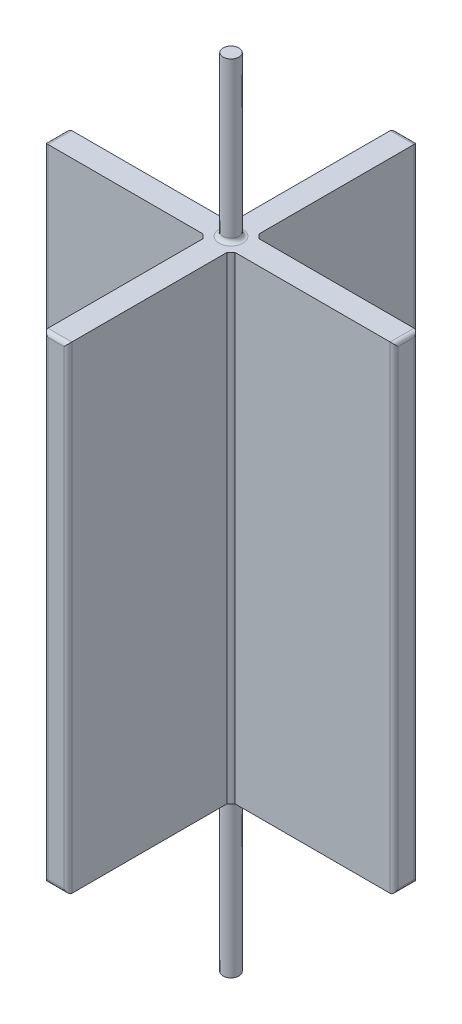
ISO-10303-21;
HEADER;
FILE_DESCRIPTION(('STEP AP214'),'2;1');
FILE_NAME('part.step','',(''),(''),'','','');
FILE_SCHEMA(('AUTOMOTIVE_DESIGN { 1 0 10303 214 1 1 1 1 }'));
ENDSEC;
DATA;
#1=APPLICATION_CONTEXT('core data for automotive mechanical design processes');
#2=APPLICATION_PROTOCOL_DEFINITION('international standard','automotive_design',2000,#1);
#3=PRODUCT_CONTEXT('',#1,'mechanical');
#4=PRODUCT('Part','Part','',(#3));
#5=PRODUCT_RELATED_PRODUCT_CATEGORY('part','',(#4));
#6=PRODUCT_DEFINITION_FORMATION('','',#4);
#7=PRODUCT_DEFINITION_CONTEXT('part definition',#1,'design');
#8=PRODUCT_DEFINITION('design','',#6,#7);
#9=PRODUCT_DEFINITION_SHAPE('','',#8);
#10=(LENGTH_UNIT() NAMED_UNIT(*) SI_UNIT(.MILLI.,.METRE.));
#11=(NAMED_UNIT(*) PLANE_ANGLE_UNIT() SI_UNIT($,.RADIAN.));
#12=(NAMED_UNIT(*) SI_UNIT($,.STERADIAN.) SOLID_ANGLE_UNIT());
#13=UNCERTAINTY_MEASURE_WITH_UNIT(LENGTH_MEASURE(1.E-05),#10,'distance_accuracy_value','');
#14=(GEOMETRIC_REPRESENTATION_CONTEXT(3) GLOBAL_UNCERTAINTY_ASSIGNED_CONTEXT((#13)) GLOBAL_UNIT_ASSIGNED_CONTEXT((#10,
#11,#12)) REPRESENTATION_CONTEXT('',''));
#15=CARTESIAN_POINT('',(0.,0.,0.));
#16=DIRECTION('',(0.,0.,1.));
#17=DIRECTION('',(1.,0.,0.));
#18=AXIS2_PLACEMENT_3D('',#15,#16,#17);
#19=CARTESIAN_POINT('',(0.,60.,-1.50000000000001));
#20=DIRECTION('',(0.,0.,1.));
#21=DIRECTION('',(1.,0.,0.));
#22=AXIS2_PLACEMENT_3D('',#19,#20,#21);
#23=PLANE('',#22);
#24=DIRECTION('',(-1.,0.,0.));
#25=VECTOR('',#24,1.);
#26=CARTESIAN_POINT('',(0.,60.,-1.50000000000001));
#27=LINE('',#26,#25);
#28=CARTESIAN_POINT('',(21.5,60.,-1.49999999999993));
#29=VERTEX_POINT('',#28);
#30=CARTESIAN_POINT('',(2.,60.,-1.5));
#31=VERTEX_POINT('',#30);
#32=EDGE_CURVE('E333',#29,#31,#27,.T.);
#33=ORIENTED_EDGE('',*,*,#32,.F.);
#34=DIRECTION('',(0.,-1.,0.));
#35=VECTOR('',#34,1.);
#36=CARTESIAN_POINT('',(21.5,0.,-1.49999999999993));
#37=LINE('',#36,#35);
#38=CARTESIAN_POINT('',(21.5,0.,-1.49999999999993));
#39=VERTEX_POINT('',#38);
#40=EDGE_CURVE('E385',#29,#39,#37,.T.);
#41=ORIENTED_EDGE('',*,*,#40,.T.);
#42=DIRECTION('',(-1.,0.,0.));
#43=VECTOR('',#42,1.);
#44=CARTESIAN_POINT('',(0.,0.,-1.50000000000001));
#45=LINE('',#44,#43);
#46=CARTESIAN_POINT('',(2.,0.,-1.5));
#47=VERTEX_POINT('',#46);
#48=EDGE_CURVE('E359',#39,#47,#45,.T.);
#49=ORIENTED_EDGE('',*,*,#48,.T.);
#50=DIRECTION('',(0.,-1.,0.));
#51=VECTOR('',#50,1.);
#52=CARTESIAN_POINT('',(2.,60.,-1.5));
#53=LINE('',#52,#51);
#54=EDGE_CURVE('E351',#31,#47,#53,.T.);
#55=ORIENTED_EDGE('',*,*,#54,.F.);
#56=EDGE_LOOP('',(#33,#41,#49,#55));
#57=FACE_BOUND('',#56,.T.);
#58=ADVANCED_FACE('F172',(#57),#23,.F.);
#59=CARTESIAN_POINT('',(0.,60.,0.));
#60=DIRECTION('',(0.,-1.,0.));
#61=DIRECTION('',(0.,0.,-1.));
#62=AXIS2_PLACEMENT_3D('',#59,#60,#61);
#63=CYLINDRICAL_SURFACE('',#62,2.5);
#64=CARTESIAN_POINT('',(0.,0.,0.));
#65=DIRECTION('',(0.,1.,0.));
#66=DIRECTION('',(0.,0.,1.));
#67=AXIS2_PLACEMENT_3D('',#64,#65,#66);
#68=CIRCLE('',#67,2.5);
#69=CARTESIAN_POINT('',(1.50000000000001,0.,-2.));
#70=VERTEX_POINT('',#69);
#71=EDGE_CURVE('E587',#47,#70,#68,.T.);
#72=ORIENTED_EDGE('',*,*,#71,.T.);
#73=DIRECTION('',(0.,-1.,0.));
#74=VECTOR('',#73,1.);
#75=CARTESIAN_POINT('',(1.50000000000001,60.,-2.));
#76=LINE('',#75,#74);
#77=CARTESIAN_POINT('',(1.50000000000001,60.,-2.));
#78=VERTEX_POINT('',#77);
#79=EDGE_CURVE('E353',#78,#70,#76,.T.);
#80=ORIENTED_EDGE('',*,*,#79,.F.);
#81=CARTESIAN_POINT('',(0.,60.,0.));
#82=DIRECTION('',(0.,1.,0.));
#83=DIRECTION('',(0.,0.,1.));
#84=AXIS2_PLACEMENT_3D('',#81,#82,#83);
#85=CIRCLE('',#84,2.5);
#86=EDGE_CURVE('E338',#31,#78,#85,.T.);
#87=ORIENTED_EDGE('',*,*,#86,.F.);
#88=ORIENTED_EDGE('',*,*,#54,.T.);
#89=EDGE_LOOP('',(#72,#80,#87,#88));
#90=FACE_BOUND('',#89,.T.);
#91=ADVANCED_FACE('F350',(#90),#63,.T.);
#92=CARTESIAN_POINT('',(1.50000000000001,60.,0.));
#93=DIRECTION('',(1.,0.,0.));
#94=DIRECTION('',(0.,0.,-1.));
#95=AXIS2_PLACEMENT_3D('',#92,#93,#94);
#96=PLANE('',#95);
#97=DIRECTION('',(0.,0.,1.));
#98=VECTOR('',#97,1.);
#99=CARTESIAN_POINT('',(1.50000000000001,0.,0.));
#100=LINE('',#99,#98);
#101=CARTESIAN_POINT('',(1.5,0.,-21.5));
#102=VERTEX_POINT('',#101);
#103=EDGE_CURVE('E582',#102,#70,#100,.T.);
#104=ORIENTED_EDGE('',*,*,#103,.F.);
#105=DIRECTION('',(0.,-1.,0.));
#106=VECTOR('',#105,1.);
#107=CARTESIAN_POINT('',(1.5,60.,-21.5));
#108=LINE('',#107,#106);
#109=CARTESIAN_POINT('',(1.5,60.,-21.5));
#110=VERTEX_POINT('',#109);
#111=EDGE_CURVE('E429',#102,#110,#108,.F.);
#112=ORIENTED_EDGE('',*,*,#111,.T.);
#113=DIRECTION('',(0.,0.,1.));
#114=VECTOR('',#113,1.);
#115=CARTESIAN_POINT('',(1.50000000000001,60.,0.));
#116=LINE('',#115,#114);
#117=EDGE_CURVE('E354',#110,#78,#116,.T.);
#118=ORIENTED_EDGE('',*,*,#117,.T.);
#119=ORIENTED_EDGE('',*,*,#79,.T.);
#120=EDGE_LOOP('',(#104,#112,#118,#119));
#121=FACE_BOUND('',#120,.T.);
#122=ADVANCED_FACE('F500',(#121),#96,.T.);
#123=CARTESIAN_POINT('',(0.,60.,-22.));
#124=DIRECTION('',(0.,0.,-1.));
#125=DIRECTION('',(-1.,0.,0.));
#126=AXIS2_PLACEMENT_3D('',#123,#124,#125);
#127=PLANE('',#126);
#128=DIRECTION('',(1.,0.,0.));
#129=VECTOR('',#128,1.);
#130=CARTESIAN_POINT('',(0.,59.5,-22.));
#131=LINE('',#130,#129);
#132=CARTESIAN_POINT('',(-1.,59.5,-22.));
#133=VERTEX_POINT('',#132);
#134=CARTESIAN_POINT('',(0.999999999999997,59.5,-22.));
#135=VERTEX_POINT('',#134);
#136=EDGE_CURVE('E187',#133,#135,#131,.T.);
#137=ORIENTED_EDGE('',*,*,#136,.T.);
#138=DIRECTION('',(0.,-1.,0.));
#139=VECTOR('',#138,1.);
#140=CARTESIAN_POINT('',(0.999999999999997,60.,-22.));
#141=LINE('',#140,#139);
#142=CARTESIAN_POINT('',(0.999999999999997,0.5,-22.));
#143=VERTEX_POINT('',#142);
#144=EDGE_CURVE('E427',#135,#143,#141,.T.);
#145=ORIENTED_EDGE('',*,*,#144,.T.);
#146=DIRECTION('',(1.,0.,0.));
#147=VECTOR('',#146,1.);
#148=CARTESIAN_POINT('',(-1.5,0.5,-22.));
#149=LINE('',#148,#147);
#150=CARTESIAN_POINT('',(-1.,0.5,-22.));
#151=VERTEX_POINT('',#150);
#152=EDGE_CURVE('E423',#143,#151,#149,.F.);
#153=ORIENTED_EDGE('',*,*,#152,.T.);
#154=DIRECTION('',(0.,-1.,0.));
#155=VECTOR('',#154,1.);
#156=CARTESIAN_POINT('',(-1.,60.,-22.));
#157=LINE('',#156,#155);
#158=EDGE_CURVE('E192',#151,#133,#157,.F.);
#159=ORIENTED_EDGE('',*,*,#158,.T.);
#160=EDGE_LOOP('',(#137,#145,#153,#159));
#161=FACE_BOUND('',#160,.T.);
#162=ADVANCED_FACE('F713',(#161),#127,.T.);
#163=CARTESIAN_POINT('',(-1.50000000000001,60.,0.));
#164=DIRECTION('',(1.,0.,0.));
#165=DIRECTION('',(0.,0.,-1.));
#166=AXIS2_PLACEMENT_3D('',#163,#164,#165);
#167=PLANE('',#166);
#168=DIRECTION('',(0.,0.,1.));
#169=VECTOR('',#168,1.);
#170=CARTESIAN_POINT('',(-1.50000000000001,60.,0.));
#171=LINE('',#170,#169);
#172=CARTESIAN_POINT('',(-1.5,60.,-21.5));
#173=VERTEX_POINT('',#172);
#174=CARTESIAN_POINT('',(-1.50000000000001,60.,-2.));
#175=VERTEX_POINT('',#174);
#176=EDGE_CURVE('E593',#173,#175,#171,.T.);
#177=ORIENTED_EDGE('',*,*,#176,.F.);
#178=DIRECTION('',(0.,-1.,0.));
#179=VECTOR('',#178,1.);
#180=CARTESIAN_POINT('',(-1.5,0.,-21.5));
#181=LINE('',#180,#179);
#182=CARTESIAN_POINT('',(-1.5,0.,-21.5));
#183=VERTEX_POINT('',#182);
#184=EDGE_CURVE('E432',#173,#183,#181,.T.);
#185=ORIENTED_EDGE('',*,*,#184,.T.);
#186=DIRECTION('',(0.,0.,1.));
#187=VECTOR('',#186,1.);
#188=CARTESIAN_POINT('',(-1.50000000000001,0.,0.));
#189=LINE('',#188,#187);
#190=CARTESIAN_POINT('',(-1.50000000000001,0.,-2.));
#191=VERTEX_POINT('',#190);
#192=EDGE_CURVE('E584',#183,#191,#189,.T.);
#193=ORIENTED_EDGE('',*,*,#192,.T.);
#194=DIRECTION('',(0.,-1.,0.));
#195=VECTOR('',#194,1.);
#196=CARTESIAN_POINT('',(-1.50000000000001,60.,-2.));
#197=LINE('',#196,#195);
#198=EDGE_CURVE('E365',#175,#191,#197,.T.);
#199=ORIENTED_EDGE('',*,*,#198,.F.);
#200=EDGE_LOOP('',(#177,#185,#193,#199));
#201=FACE_BOUND('',#200,.T.);
#202=ADVANCED_FACE('F596',(#201),#167,.F.);
#203=CARTESIAN_POINT('',(-1.99999999999998,0.,-1.50000000000003));
#204=VERTEX_POINT('',#203);
#205=EDGE_CURVE('E616',#191,#204,#68,.T.);
#206=ORIENTED_EDGE('',*,*,#205,.T.);
#207=DIRECTION('',(0.,-1.,0.));
#208=VECTOR('',#207,1.);
#209=CARTESIAN_POINT('',(-1.99999999999998,60.,-1.50000000000003));
#210=LINE('',#209,#208);
#211=CARTESIAN_POINT('',(-1.99999999999998,60.,-1.50000000000003));
#212=VERTEX_POINT('',#211);
#213=EDGE_CURVE('E640',#212,#204,#210,.T.);
#214=ORIENTED_EDGE('',*,*,#213,.F.);
#215=EDGE_CURVE('E357',#175,#212,#85,.T.);
#216=ORIENTED_EDGE('',*,*,#215,.F.);
#217=ORIENTED_EDGE('',*,*,#198,.T.);
#218=EDGE_LOOP('',(#206,#214,#216,#217));
#219=FACE_BOUND('',#218,.T.);
#220=ADVANCED_FACE('F502',(#219),#63,.T.);
#221=CARTESIAN_POINT('',(0.,60.,-1.50000000000001));
#222=DIRECTION('',(0.,0.,-1.));
#223=DIRECTION('',(-1.,0.,0.));
#224=AXIS2_PLACEMENT_3D('',#221,#222,#223);
#225=PLANE('',#224);
#226=DIRECTION('',(1.,0.,0.));
#227=VECTOR('',#226,1.);
#228=CARTESIAN_POINT('',(0.,0.,-1.50000000000001));
#229=LINE('',#228,#227);
#230=CARTESIAN_POINT('',(-21.5,0.,-1.50000000000022));
#231=VERTEX_POINT('',#230);
#232=EDGE_CURVE('E619',#231,#204,#229,.T.);
#233=ORIENTED_EDGE('',*,*,#232,.F.);
#234=DIRECTION('',(0.,-1.,0.));
#235=VECTOR('',#234,1.);
#236=CARTESIAN_POINT('',(-21.5,60.,-1.50000000000022));
#237=LINE('',#236,#235);
#238=CARTESIAN_POINT('',(-21.5,60.,-1.50000000000022));
#239=VERTEX_POINT('',#238);
#240=EDGE_CURVE('E418',#231,#239,#237,.F.);
#241=ORIENTED_EDGE('',*,*,#240,.T.);
#242=DIRECTION('',(1.,0.,0.));
#243=VECTOR('',#242,1.);
#244=CARTESIAN_POINT('',(0.,60.,-1.50000000000001));
#245=LINE('',#244,#243);
#246=EDGE_CURVE('E600',#239,#212,#245,.T.);
#247=ORIENTED_EDGE('',*,*,#246,.T.);
#248=ORIENTED_EDGE('',*,*,#213,.T.);
#249=EDGE_LOOP('',(#233,#241,#247,#248));
#250=FACE_BOUND('',#249,.T.);
#251=ADVANCED_FACE('F707',(#250),#225,.T.);
#252=CARTESIAN_POINT('',(-22.,60.,-2.54426109809932E-13));
#253=DIRECTION('',(-1.,0.,0.));
#254=DIRECTION('',(0.,0.,1.));
#255=AXIS2_PLACEMENT_3D('',#252,#253,#254);
#256=PLANE('',#255);
#257=DIRECTION('',(0.,0.,-1.));
#258=VECTOR('',#257,1.);
#259=CARTESIAN_POINT('',(-22.,59.5,-2.54426109809932E-13));
#260=LINE('',#259,#258);
#261=CARTESIAN_POINT('',(-22.,59.5,0.999999999999771));
#262=VERTEX_POINT('',#261);
#263=CARTESIAN_POINT('',(-22.,59.5,-1.00000000000023));
#264=VERTEX_POINT('',#263);
#265=EDGE_CURVE('E413',#262,#264,#260,.T.);
#266=ORIENTED_EDGE('',*,*,#265,.T.);
#267=DIRECTION('',(0.,-1.,0.));
#268=VECTOR('',#267,1.);
#269=CARTESIAN_POINT('',(-22.,60.,-1.00000000000023));
#270=LINE('',#269,#268);
#271=CARTESIAN_POINT('',(-22.,0.5,-1.00000000000023));
#272=VERTEX_POINT('',#271);
#273=EDGE_CURVE('E415',#264,#272,#270,.T.);
#274=ORIENTED_EDGE('',*,*,#273,.T.);
#275=DIRECTION('',(0.,0.,-1.));
#276=VECTOR('',#275,1.);
#277=CARTESIAN_POINT('',(-22.,0.5,1.49999999999977));
#278=LINE('',#277,#276);
#279=CARTESIAN_POINT('',(-22.,0.5,0.999999999999771));
#280=VERTEX_POINT('',#279);
#281=EDGE_CURVE('E409',#272,#280,#278,.F.);
#282=ORIENTED_EDGE('',*,*,#281,.T.);
#283=DIRECTION('',(0.,-1.,0.));
#284=VECTOR('',#283,1.);
#285=CARTESIAN_POINT('',(-22.,60.,0.999999999999771));
#286=LINE('',#285,#284);
#287=EDGE_CURVE('E411',#280,#262,#286,.F.);
#288=ORIENTED_EDGE('',*,*,#287,.T.);
#289=EDGE_LOOP('',(#266,#274,#282,#288));
#290=FACE_BOUND('',#289,.T.);
#291=ADVANCED_FACE('F703',(#290),#256,.T.);
#292=CARTESIAN_POINT('',(0.,60.,1.50000000000001));
#293=DIRECTION('',(0.,0.,-1.));
#294=DIRECTION('',(-1.,0.,0.));
#295=AXIS2_PLACEMENT_3D('',#292,#293,#294);
#296=PLANE('',#295);
#297=DIRECTION('',(1.,0.,0.));
#298=VECTOR('',#297,1.);
#299=CARTESIAN_POINT('',(0.,60.,1.50000000000001));
#300=LINE('',#299,#298);
#301=CARTESIAN_POINT('',(-21.5,60.,1.49999999999978));
#302=VERTEX_POINT('',#301);
#303=CARTESIAN_POINT('',(-2.00000000000001,60.,1.49999999999998));
#304=VERTEX_POINT('',#303);
#305=EDGE_CURVE('E605',#302,#304,#300,.T.);
#306=ORIENTED_EDGE('',*,*,#305,.F.);
#307=DIRECTION('',(0.,-1.,0.));
#308=VECTOR('',#307,1.);
#309=CARTESIAN_POINT('',(-21.5,0.,1.49999999999978));
#310=LINE('',#309,#308);
#311=CARTESIAN_POINT('',(-21.5,0.,1.49999999999978));
#312=VERTEX_POINT('',#311);
#313=EDGE_CURVE('E421',#302,#312,#310,.T.);
#314=ORIENTED_EDGE('',*,*,#313,.T.);
#315=DIRECTION('',(1.,0.,0.));
#316=VECTOR('',#315,1.);
#317=CARTESIAN_POINT('',(0.,0.,1.50000000000001));
#318=LINE('',#317,#316);
#319=CARTESIAN_POINT('',(-2.00000000000001,0.,1.49999999999998));
#320=VERTEX_POINT('',#319);
#321=EDGE_CURVE('E621',#312,#320,#318,.T.);
#322=ORIENTED_EDGE('',*,*,#321,.T.);
#323=DIRECTION('',(0.,-1.,0.));
#324=VECTOR('',#323,1.);
#325=CARTESIAN_POINT('',(-2.00000000000001,60.,1.49999999999998));
#326=LINE('',#325,#324);
#327=EDGE_CURVE('E637',#304,#320,#326,.T.);
#328=ORIENTED_EDGE('',*,*,#327,.F.);
#329=EDGE_LOOP('',(#306,#314,#322,#328));
#330=FACE_BOUND('',#329,.T.);
#331=ADVANCED_FACE('F700',(#330),#296,.F.);
#332=CARTESIAN_POINT('',(-1.50000000000002,0.,1.99999999999999));
#333=VERTEX_POINT('',#332);
#334=EDGE_CURVE('E623',#320,#333,#68,.T.);
#335=ORIENTED_EDGE('',*,*,#334,.T.);
#336=DIRECTION('',(0.,-1.,0.));
#337=VECTOR('',#336,1.);
#338=CARTESIAN_POINT('',(-1.50000000000002,60.,1.99999999999999));
#339=LINE('',#338,#337);
#340=CARTESIAN_POINT('',(-1.50000000000002,60.,1.99999999999999));
#341=VERTEX_POINT('',#340);
#342=EDGE_CURVE('E634',#341,#333,#339,.T.);
#343=ORIENTED_EDGE('',*,*,#342,.F.);
#344=EDGE_CURVE('E601',#304,#341,#85,.T.);
#345=ORIENTED_EDGE('',*,*,#344,.F.);
#346=ORIENTED_EDGE('',*,*,#327,.T.);
#347=EDGE_LOOP('',(#335,#343,#345,#346));
#348=FACE_BOUND('',#347,.T.);
#349=ADVANCED_FACE('F670',(#348),#63,.T.);
#350=CARTESIAN_POINT('',(-1.50000000000001,60.,0.));
#351=DIRECTION('',(-1.,0.,0.));
#352=DIRECTION('',(0.,0.,1.));
#353=AXIS2_PLACEMENT_3D('',#350,#351,#352);
#354=PLANE('',#353);
#355=DIRECTION('',(0.,0.,-1.));
#356=VECTOR('',#355,1.);
#357=CARTESIAN_POINT('',(-1.50000000000001,0.,0.));
#358=LINE('',#357,#356);
#359=CARTESIAN_POINT('',(-1.50000000000015,0.,21.5));
#360=VERTEX_POINT('',#359);
#361=EDGE_CURVE('E624',#360,#333,#358,.T.);
#362=ORIENTED_EDGE('',*,*,#361,.F.);
#363=DIRECTION('',(0.,-1.,0.));
#364=VECTOR('',#363,1.);
#365=CARTESIAN_POINT('',(-1.50000000000015,60.,21.5));
#366=LINE('',#365,#364);
#367=CARTESIAN_POINT('',(-1.50000000000015,60.,21.5));
#368=VERTEX_POINT('',#367);
#369=EDGE_CURVE('E404',#360,#368,#366,.F.);
#370=ORIENTED_EDGE('',*,*,#369,.T.);
#371=DIRECTION('',(0.,0.,-1.));
#372=VECTOR('',#371,1.);
#373=CARTESIAN_POINT('',(-1.50000000000001,60.,0.));
#374=LINE('',#373,#372);
#375=EDGE_CURVE('E607',#368,#341,#374,.T.);
#376=ORIENTED_EDGE('',*,*,#375,.T.);
#377=ORIENTED_EDGE('',*,*,#342,.T.);
#378=EDGE_LOOP('',(#362,#370,#376,#377));
#379=FACE_BOUND('',#378,.T.);
#380=ADVANCED_FACE('F673',(#379),#354,.T.);
#381=CARTESIAN_POINT('',(-1.52655665885959E-13,60.,22.));
#382=DIRECTION('',(0.,0.,1.));
#383=DIRECTION('',(1.,0.,0.));
#384=AXIS2_PLACEMENT_3D('',#381,#382,#383);
#385=PLANE('',#384);
#386=DIRECTION('',(-1.,0.,0.));
#387=VECTOR('',#386,1.);
#388=CARTESIAN_POINT('',(-1.52655665885959E-13,59.5,22.));
#389=LINE('',#388,#387);
#390=CARTESIAN_POINT('',(0.999999999999849,59.5,22.));
#391=VERTEX_POINT('',#390);
#392=CARTESIAN_POINT('',(-1.00000000000015,59.5,22.));
#393=VERTEX_POINT('',#392);
#394=EDGE_CURVE('E399',#391,#393,#389,.T.);
#395=ORIENTED_EDGE('',*,*,#394,.T.);
#396=DIRECTION('',(0.,-1.,0.));
#397=VECTOR('',#396,1.);
#398=CARTESIAN_POINT('',(-1.00000000000015,60.,22.));
#399=LINE('',#398,#397);
#400=CARTESIAN_POINT('',(-1.00000000000015,0.5,22.));
#401=VERTEX_POINT('',#400);
#402=EDGE_CURVE('E401',#393,#401,#399,.T.);
#403=ORIENTED_EDGE('',*,*,#402,.T.);
#404=DIRECTION('',(-1.,0.,0.));
#405=VECTOR('',#404,1.);
#406=CARTESIAN_POINT('',(1.49999999999985,0.5,22.));
#407=LINE('',#406,#405);
#408=CARTESIAN_POINT('',(0.999999999999849,0.5,22.));
#409=VERTEX_POINT('',#408);
#410=EDGE_CURVE('E395',#401,#409,#407,.F.);
#411=ORIENTED_EDGE('',*,*,#410,.T.);
#412=DIRECTION('',(0.,-1.,0.));
#413=VECTOR('',#412,1.);
#414=CARTESIAN_POINT('',(0.999999999999849,60.,22.));
#415=LINE('',#414,#413);
#416=EDGE_CURVE('E397',#409,#391,#415,.F.);
#417=ORIENTED_EDGE('',*,*,#416,.T.);
#418=EDGE_LOOP('',(#395,#403,#411,#417));
#419=FACE_BOUND('',#418,.T.);
#420=ADVANCED_FACE('F683',(#419),#385,.T.);
#421=CARTESIAN_POINT('',(1.50000000000001,60.,0.));
#422=DIRECTION('',(-1.,0.,0.));
#423=DIRECTION('',(0.,0.,1.));
#424=AXIS2_PLACEMENT_3D('',#421,#422,#423);
#425=PLANE('',#424);
#426=DIRECTION('',(0.,0.,-1.));
#427=VECTOR('',#426,1.);
#428=CARTESIAN_POINT('',(1.50000000000001,60.,0.));
#429=LINE('',#428,#427);
#430=CARTESIAN_POINT('',(1.49999999999985,60.,21.5));
#431=VERTEX_POINT('',#430);
#432=CARTESIAN_POINT('',(1.49999999999999,60.,2.00000000000001));
#433=VERTEX_POINT('',#432);
#434=EDGE_CURVE('E609',#431,#433,#429,.T.);
#435=ORIENTED_EDGE('',*,*,#434,.F.);
#436=DIRECTION('',(0.,-1.,0.));
#437=VECTOR('',#436,1.);
#438=CARTESIAN_POINT('',(1.49999999999985,0.,21.5));
#439=LINE('',#438,#437);
#440=CARTESIAN_POINT('',(1.49999999999985,0.,21.5));
#441=VERTEX_POINT('',#440);
#442=EDGE_CURVE('E407',#431,#441,#439,.T.);
#443=ORIENTED_EDGE('',*,*,#442,.T.);
#444=DIRECTION('',(0.,0.,-1.));
#445=VECTOR('',#444,1.);
#446=CARTESIAN_POINT('',(1.50000000000001,0.,0.));
#447=LINE('',#446,#445);
#448=CARTESIAN_POINT('',(1.49999999999999,0.,2.00000000000001));
#449=VERTEX_POINT('',#448);
#450=EDGE_CURVE('E626',#441,#449,#447,.T.);
#451=ORIENTED_EDGE('',*,*,#450,.T.);
#452=DIRECTION('',(0.,-1.,0.));
#453=VECTOR('',#452,1.);
#454=CARTESIAN_POINT('',(1.49999999999999,60.,2.00000000000001));
#455=LINE('',#454,#453);
#456=EDGE_CURVE('E631',#433,#449,#455,.T.);
#457=ORIENTED_EDGE('',*,*,#456,.F.);
#458=EDGE_LOOP('',(#435,#443,#451,#457));
#459=FACE_BOUND('',#458,.T.);
#460=ADVANCED_FACE('F688',(#459),#425,.F.);
#461=CARTESIAN_POINT('',(1.99999999999999,0.,1.50000000000001));
#462=VERTEX_POINT('',#461);
#463=EDGE_CURVE('E615',#449,#462,#68,.T.);
#464=ORIENTED_EDGE('',*,*,#463,.T.);
#465=DIRECTION('',(0.,-1.,0.));
#466=VECTOR('',#465,1.);
#467=CARTESIAN_POINT('',(1.99999999999999,60.,1.50000000000001));
#468=LINE('',#467,#466);
#469=CARTESIAN_POINT('',(1.99999999999999,60.,1.50000000000001));
#470=VERTEX_POINT('',#469);
#471=EDGE_CURVE('E613',#470,#462,#468,.T.);
#472=ORIENTED_EDGE('',*,*,#471,.F.);
#473=EDGE_CURVE('E356',#433,#470,#85,.T.);
#474=ORIENTED_EDGE('',*,*,#473,.F.);
#475=ORIENTED_EDGE('',*,*,#456,.T.);
#476=EDGE_LOOP('',(#464,#472,#474,#475));
#477=FACE_BOUND('',#476,.T.);
#478=ADVANCED_FACE('F503',(#477),#63,.T.);
#479=CARTESIAN_POINT('',(0.,60.,1.50000000000001));
#480=DIRECTION('',(0.,0.,1.));
#481=DIRECTION('',(1.,0.,0.));
#482=AXIS2_PLACEMENT_3D('',#479,#480,#481);
#483=PLANE('',#482);
#484=DIRECTION('',(-1.,0.,0.));
#485=VECTOR('',#484,1.);
#486=CARTESIAN_POINT('',(0.,0.,1.50000000000001));
#487=LINE('',#486,#485);
#488=CARTESIAN_POINT('',(21.5,0.,1.50000000000007));
#489=VERTEX_POINT('',#488);
#490=EDGE_CURVE('E345',#489,#462,#487,.T.);
#491=ORIENTED_EDGE('',*,*,#490,.F.);
#492=DIRECTION('',(0.,-1.,0.));
#493=VECTOR('',#492,1.);
#494=CARTESIAN_POINT('',(21.5,60.,1.50000000000007));
#495=LINE('',#494,#493);
#496=CARTESIAN_POINT('',(21.5,60.,1.50000000000007));
#497=VERTEX_POINT('',#496);
#498=EDGE_CURVE('E375',#489,#497,#495,.F.);
#499=ORIENTED_EDGE('',*,*,#498,.T.);
#500=DIRECTION('',(-1.,0.,0.));
#501=VECTOR('',#500,1.);
#502=CARTESIAN_POINT('',(0.,60.,1.50000000000001));
#503=LINE('',#502,#501);
#504=EDGE_CURVE('E611',#497,#470,#503,.T.);
#505=ORIENTED_EDGE('',*,*,#504,.T.);
#506=ORIENTED_EDGE('',*,*,#471,.T.);
#507=EDGE_LOOP('',(#491,#499,#505,#506));
#508=FACE_BOUND('',#507,.T.);
#509=ADVANCED_FACE('F662',(#508),#483,.T.);
#510=CARTESIAN_POINT('',(22.,60.,1.01770443923973E-13));
#511=DIRECTION('',(1.,0.,0.));
#512=DIRECTION('',(0.,0.,-1.));
#513=AXIS2_PLACEMENT_3D('',#510,#511,#512);
#514=PLANE('',#513);
#515=DIRECTION('',(0.,0.,1.));
#516=VECTOR('',#515,1.);
#517=CARTESIAN_POINT('',(22.,59.5,1.01770443923973E-13));
#518=LINE('',#517,#516);
#519=CARTESIAN_POINT('',(22.,59.5,-0.999999999999925));
#520=VERTEX_POINT('',#519);
#521=CARTESIAN_POINT('',(22.,59.5,1.00000000000007));
#522=VERTEX_POINT('',#521);
#523=EDGE_CURVE('E370',#520,#522,#518,.T.);
#524=ORIENTED_EDGE('',*,*,#523,.T.);
#525=DIRECTION('',(0.,-1.,0.));
#526=VECTOR('',#525,1.);
#527=CARTESIAN_POINT('',(22.,60.,1.00000000000007));
#528=LINE('',#527,#526);
#529=CARTESIAN_POINT('',(22.,0.5,1.00000000000007));
#530=VERTEX_POINT('',#529);
#531=EDGE_CURVE('E372',#522,#530,#528,.T.);
#532=ORIENTED_EDGE('',*,*,#531,.T.);
#533=DIRECTION('',(0.,0.,1.));
#534=VECTOR('',#533,1.);
#535=CARTESIAN_POINT('',(22.,0.5,-1.49999999999993));
#536=LINE('',#535,#534);
#537=CARTESIAN_POINT('',(22.,0.5,-0.999999999999925));
#538=VERTEX_POINT('',#537);
#539=EDGE_CURVE('E361',#530,#538,#536,.F.);
#540=ORIENTED_EDGE('',*,*,#539,.T.);
#541=DIRECTION('',(0.,-1.,0.));
#542=VECTOR('',#541,1.);
#543=CARTESIAN_POINT('',(22.,60.,-0.999999999999925));
#544=LINE('',#543,#542);
#545=EDGE_CURVE('E363',#538,#520,#544,.F.);
#546=ORIENTED_EDGE('',*,*,#545,.T.);
#547=EDGE_LOOP('',(#524,#532,#540,#546));
#548=FACE_BOUND('',#547,.T.);
#549=ADVANCED_FACE('F762',(#548),#514,.T.);
#550=CARTESIAN_POINT('',(0.,60.,0.));
#551=DIRECTION('',(0.,1.,0.));
#552=DIRECTION('',(0.,0.,1.));
#553=AXIS2_PLACEMENT_3D('',#550,#551,#552);
#554=PLANE('',#553);
#555=CARTESIAN_POINT('',(0.,60.,0.));
#556=DIRECTION('',(0.,1.,0.));
#557=DIRECTION('',(0.,0.,1.));
#558=AXIS2_PLACEMENT_3D('',#555,#556,#557);
#559=CIRCLE('',#558,1.5007786274835);
#560=CARTESIAN_POINT('',(0.,60.,1.5007786274835));
#561=VERTEX_POINT('',#560);
#562=EDGE_CURVE('E478',#561,#561,#559,.F.);
#563=ORIENTED_EDGE('',*,*,#562,.T.);
#564=EDGE_LOOP('',(#563));
#565=FACE_BOUND('',#564,.T.);
#566=ORIENTED_EDGE('',*,*,#504,.F.);
#567=DIRECTION('',(0.,0.,1.));
#568=VECTOR('',#567,1.);
#569=CARTESIAN_POINT('',(21.5,60.,0.));
#570=LINE('',#569,#568);
#571=EDGE_CURVE('E341',#497,#29,#570,.F.);
#572=ORIENTED_EDGE('',*,*,#571,.T.);
#573=ORIENTED_EDGE('',*,*,#32,.T.);
#574=ORIENTED_EDGE('',*,*,#86,.T.);
#575=ORIENTED_EDGE('',*,*,#117,.F.);
#576=DIRECTION('',(1.,0.,0.));
#577=VECTOR('',#576,1.);
#578=CARTESIAN_POINT('',(0.,60.,-21.5));
#579=LINE('',#578,#577);
#580=EDGE_CURVE('E378',#110,#173,#579,.F.);
#581=ORIENTED_EDGE('',*,*,#580,.T.);
#582=ORIENTED_EDGE('',*,*,#176,.T.);
#583=ORIENTED_EDGE('',*,*,#215,.T.);
#584=ORIENTED_EDGE('',*,*,#246,.F.);
#585=DIRECTION('',(0.,0.,-1.));
#586=VECTOR('',#585,1.);
#587=CARTESIAN_POINT('',(-21.5,60.,-2.48643698223342E-13));
#588=LINE('',#587,#586);
#589=EDGE_CURVE('E380',#239,#302,#588,.F.);
#590=ORIENTED_EDGE('',*,*,#589,.T.);
#591=ORIENTED_EDGE('',*,*,#305,.T.);
#592=ORIENTED_EDGE('',*,*,#344,.T.);
#593=ORIENTED_EDGE('',*,*,#375,.F.);
#594=DIRECTION('',(-1.,0.,0.));
#595=VECTOR('',#594,1.);
#596=CARTESIAN_POINT('',(-1.49186218934005E-13,60.,21.5));
#597=LINE('',#596,#595);
#598=EDGE_CURVE('E382',#368,#431,#597,.F.);
#599=ORIENTED_EDGE('',*,*,#598,.T.);
#600=ORIENTED_EDGE('',*,*,#434,.T.);
#601=ORIENTED_EDGE('',*,*,#473,.T.);
#602=EDGE_LOOP('',(#566,#572,#573,#574,#575,#581,#582,#583,#584,#590,#591,#592,#593,#599,#600,#601));
#603=FACE_BOUND('',#602,.T.);
#604=ADVANCED_FACE('F336',(#565,#603),#554,.T.);
#605=CARTESIAN_POINT('',(0.,0.,0.));
#606=DIRECTION('',(0.,1.,0.));
#607=DIRECTION('',(0.,0.,1.));
#608=AXIS2_PLACEMENT_3D('',#605,#606,#607);
#609=PLANE('',#608);
#610=CARTESIAN_POINT('',(0.,0.,0.));
#611=DIRECTION('',(0.,1.,0.));
#612=DIRECTION('',(0.,0.,1.));
#613=AXIS2_PLACEMENT_3D('',#610,#611,#612);
#614=CIRCLE('',#613,1.5007786274835);
#615=CARTESIAN_POINT('',(0.,0.,1.5007786274835));
#616=VERTEX_POINT('',#615);
#617=EDGE_CURVE('E12',#616,#616,#614,.T.);
#618=ORIENTED_EDGE('',*,*,#617,.T.);
#619=EDGE_LOOP('',(#618));
#620=FACE_BOUND('',#619,.T.);
#621=ORIENTED_EDGE('',*,*,#48,.F.);
#622=DIRECTION('',(0.,0.,1.));
#623=VECTOR('',#622,1.);
#624=CARTESIAN_POINT('',(21.5,0.,1.50000000000007));
#625=LINE('',#624,#623);
#626=EDGE_CURVE('E393',#39,#489,#625,.T.);
#627=ORIENTED_EDGE('',*,*,#626,.T.);
#628=ORIENTED_EDGE('',*,*,#490,.T.);
#629=ORIENTED_EDGE('',*,*,#463,.F.);
#630=ORIENTED_EDGE('',*,*,#450,.F.);
#631=DIRECTION('',(-1.,0.,0.));
#632=VECTOR('',#631,1.);
#633=CARTESIAN_POINT('',(-1.50000000000015,0.,21.5));
#634=LINE('',#633,#632);
#635=EDGE_CURVE('E391',#441,#360,#634,.T.);
#636=ORIENTED_EDGE('',*,*,#635,.T.);
#637=ORIENTED_EDGE('',*,*,#361,.T.);
#638=ORIENTED_EDGE('',*,*,#334,.F.);
#639=ORIENTED_EDGE('',*,*,#321,.F.);
#640=DIRECTION('',(0.,0.,-1.));
#641=VECTOR('',#640,1.);
#642=CARTESIAN_POINT('',(-21.5,0.,-1.50000000000022));
#643=LINE('',#642,#641);
#644=EDGE_CURVE('E389',#312,#231,#643,.T.);
#645=ORIENTED_EDGE('',*,*,#644,.T.);
#646=ORIENTED_EDGE('',*,*,#232,.T.);
#647=ORIENTED_EDGE('',*,*,#205,.F.);
#648=ORIENTED_EDGE('',*,*,#192,.F.);
#649=DIRECTION('',(1.,0.,0.));
#650=VECTOR('',#649,1.);
#651=CARTESIAN_POINT('',(1.5,0.,-21.5));
#652=LINE('',#651,#650);
#653=EDGE_CURVE('E387',#183,#102,#652,.T.);
#654=ORIENTED_EDGE('',*,*,#653,.T.);
#655=ORIENTED_EDGE('',*,*,#103,.T.);
#656=ORIENTED_EDGE('',*,*,#71,.F.);
#657=EDGE_LOOP('',(#621,#627,#628,#629,#630,#636,#637,#638,#639,#645,#646,#647,#648,#654,#655,#656));
#658=FACE_BOUND('',#657,.T.);
#659=ADVANCED_FACE('F523',(#620,#658),#609,.F.);
#660=CARTESIAN_POINT('',(21.5,60.,-0.999999999999928));
#661=DIRECTION('',(0.,1.,0.));
#662=DIRECTION('',(0.,0.,1.));
#663=AXIS2_PLACEMENT_3D('',#660,#661,#662);
#664=CYLINDRICAL_SURFACE('',#663,0.5);
#665=CARTESIAN_POINT('',(21.5,0.5,-0.999999999999928));
#666=DIRECTION('',(0.,0.707106781186547,-0.707106781186547));
#667=DIRECTION('',(0.,-0.707106781186547,-0.707106781186547));
#668=AXIS2_PLACEMENT_3D('',#665,#666,#667);
#669=ELLIPSE('',#668,0.707106781186547,0.5);
#670=EDGE_CURVE('E440',#39,#538,#669,.F.);
#671=ORIENTED_EDGE('',*,*,#670,.F.);
#672=ORIENTED_EDGE('',*,*,#40,.F.);
#673=CARTESIAN_POINT('',(21.5,59.5,-0.999999999999928));
#674=DIRECTION('',(0.,0.707106781186547,0.707106781186547));
#675=DIRECTION('',(0.,0.707106781186547,-0.707106781186547));
#676=AXIS2_PLACEMENT_3D('',#673,#674,#675);
#677=ELLIPSE('',#676,0.707106781186547,0.5);
#678=EDGE_CURVE('E443',#520,#29,#677,.T.);
#679=ORIENTED_EDGE('',*,*,#678,.F.);
#680=ORIENTED_EDGE('',*,*,#545,.F.);
#681=EDGE_LOOP('',(#671,#672,#679,#680));
#682=FACE_BOUND('',#681,.T.);
#683=ADVANCED_FACE('F519',(#682),#664,.T.);
#684=CARTESIAN_POINT('',(21.5,59.5,0.));
#685=DIRECTION('',(0.,0.,1.));
#686=DIRECTION('',(1.,0.,0.));
#687=AXIS2_PLACEMENT_3D('',#684,#685,#686);
#688=CYLINDRICAL_SURFACE('',#687,0.5);
#689=ORIENTED_EDGE('',*,*,#678,.T.);
#690=ORIENTED_EDGE('',*,*,#571,.F.);
#691=CARTESIAN_POINT('',(21.5,59.5,1.00000000000007));
#692=DIRECTION('',(0.,-0.707106781186547,0.707106781186547));
#693=DIRECTION('',(0.,0.707106781186547,0.707106781186547));
#694=AXIS2_PLACEMENT_3D('',#691,#692,#693);
#695=ELLIPSE('',#694,0.707106781186547,0.5);
#696=EDGE_CURVE('E437',#522,#497,#695,.T.);
#697=ORIENTED_EDGE('',*,*,#696,.F.);
#698=ORIENTED_EDGE('',*,*,#523,.F.);
#699=EDGE_LOOP('',(#689,#690,#697,#698));
#700=FACE_BOUND('',#699,.T.);
#701=ADVANCED_FACE('F515',(#700),#688,.T.);
#702=CARTESIAN_POINT('',(21.5,0.5,0.));
#703=DIRECTION('',(0.,0.,-1.));
#704=DIRECTION('',(-1.,0.,0.));
#705=AXIS2_PLACEMENT_3D('',#702,#703,#704);
#706=CYLINDRICAL_SURFACE('',#705,0.5);
#707=ORIENTED_EDGE('',*,*,#670,.T.);
#708=ORIENTED_EDGE('',*,*,#539,.F.);
#709=CARTESIAN_POINT('',(21.5,0.5,1.00000000000007));
#710=DIRECTION('',(0.,-0.707106781186547,-0.707106781186547));
#711=DIRECTION('',(0.,0.707106781186547,-0.707106781186547));
#712=AXIS2_PLACEMENT_3D('',#709,#710,#711);
#713=ELLIPSE('',#712,0.707106781186547,0.5);
#714=EDGE_CURVE('E435',#489,#530,#713,.F.);
#715=ORIENTED_EDGE('',*,*,#714,.F.);
#716=ORIENTED_EDGE('',*,*,#626,.F.);
#717=EDGE_LOOP('',(#707,#708,#715,#716));
#718=FACE_BOUND('',#717,.T.);
#719=ADVANCED_FACE('F511',(#718),#706,.T.);
#720=CARTESIAN_POINT('',(21.5,60.,1.00000000000007));
#721=DIRECTION('',(0.,-1.,0.));
#722=DIRECTION('',(0.,0.,-1.));
#723=AXIS2_PLACEMENT_3D('',#720,#721,#722);
#724=CYLINDRICAL_SURFACE('',#723,0.5);
#725=ORIENTED_EDGE('',*,*,#696,.T.);
#726=ORIENTED_EDGE('',*,*,#498,.F.);
#727=ORIENTED_EDGE('',*,*,#714,.T.);
#728=ORIENTED_EDGE('',*,*,#531,.F.);
#729=EDGE_LOOP('',(#725,#726,#727,#728));
#730=FACE_BOUND('',#729,.T.);
#731=ADVANCED_FACE('F507',(#730),#724,.T.);
#732=CARTESIAN_POINT('',(0.999999999999853,60.,21.5));
#733=DIRECTION('',(0.,1.,0.));
#734=DIRECTION('',(0.,0.,1.));
#735=AXIS2_PLACEMENT_3D('',#732,#733,#734);
#736=CYLINDRICAL_SURFACE('',#735,0.5);
#737=CARTESIAN_POINT('',(0.999999999999853,0.5,21.5));
#738=DIRECTION('',(0.707106781186547,0.707106781186547,0.));
#739=DIRECTION('',(0.707106781186547,-0.707106781186547,0.));
#740=AXIS2_PLACEMENT_3D('',#737,#738,#739);
#741=ELLIPSE('',#740,0.707106781186547,0.5);
#742=EDGE_CURVE('E451',#441,#409,#741,.F.);
#743=ORIENTED_EDGE('',*,*,#742,.F.);
#744=ORIENTED_EDGE('',*,*,#442,.F.);
#745=CARTESIAN_POINT('',(0.999999999999853,59.5,21.5));
#746=DIRECTION('',(-0.707106781186547,0.707106781186547,0.));
#747=DIRECTION('',(0.707106781186547,0.707106781186547,0.));
#748=AXIS2_PLACEMENT_3D('',#745,#746,#747);
#749=ELLIPSE('',#748,0.707106781186547,0.5);
#750=EDGE_CURVE('E438',#391,#431,#749,.T.);
#751=ORIENTED_EDGE('',*,*,#750,.F.);
#752=ORIENTED_EDGE('',*,*,#416,.F.);
#753=EDGE_LOOP('',(#743,#744,#751,#752));
#754=FACE_BOUND('',#753,.T.);
#755=ADVANCED_FACE('F510',(#754),#736,.T.);
#756=CARTESIAN_POINT('',(-1.49186218934005E-13,59.5,21.5));
#757=DIRECTION('',(-1.,0.,0.));
#758=DIRECTION('',(0.,0.,1.));
#759=AXIS2_PLACEMENT_3D('',#756,#757,#758);
#760=CYLINDRICAL_SURFACE('',#759,0.5);
#761=ORIENTED_EDGE('',*,*,#750,.T.);
#762=ORIENTED_EDGE('',*,*,#598,.F.);
#763=CARTESIAN_POINT('',(-1.00000000000015,59.5,21.5));
#764=DIRECTION('',(-0.707106781186547,-0.707106781186547,0.));
#765=DIRECTION('',(-0.707106781186547,0.707106781186547,0.));
#766=AXIS2_PLACEMENT_3D('',#763,#764,#765);
#767=ELLIPSE('',#766,0.707106781186547,0.5);
#768=EDGE_CURVE('E448',#393,#368,#767,.T.);
#769=ORIENTED_EDGE('',*,*,#768,.F.);
#770=ORIENTED_EDGE('',*,*,#394,.F.);
#771=EDGE_LOOP('',(#761,#762,#769,#770));
#772=FACE_BOUND('',#771,.T.);
#773=ADVANCED_FACE('F533',(#772),#760,.T.);
#774=CARTESIAN_POINT('',(-1.49186218934005E-13,0.5,21.5));
#775=DIRECTION('',(1.,0.,0.));
#776=DIRECTION('',(0.,0.,-1.));
#777=AXIS2_PLACEMENT_3D('',#774,#775,#776);
#778=CYLINDRICAL_SURFACE('',#777,0.5);
#779=ORIENTED_EDGE('',*,*,#742,.T.);
#780=ORIENTED_EDGE('',*,*,#410,.F.);
#781=CARTESIAN_POINT('',(-1.00000000000015,0.5,21.5));
#782=DIRECTION('',(0.707106781186547,-0.707106781186547,0.));
#783=DIRECTION('',(0.707106781186547,0.707106781186547,0.));
#784=AXIS2_PLACEMENT_3D('',#781,#782,#783);
#785=ELLIPSE('',#784,0.707106781186547,0.5);
#786=EDGE_CURVE('E446',#360,#401,#785,.F.);
#787=ORIENTED_EDGE('',*,*,#786,.F.);
#788=ORIENTED_EDGE('',*,*,#635,.F.);
#789=EDGE_LOOP('',(#779,#780,#787,#788));
#790=FACE_BOUND('',#789,.T.);
#791=ADVANCED_FACE('F529',(#790),#778,.T.);
#792=CARTESIAN_POINT('',(-1.00000000000015,60.,21.5));
#793=DIRECTION('',(0.,-1.,0.));
#794=DIRECTION('',(0.,0.,-1.));
#795=AXIS2_PLACEMENT_3D('',#792,#793,#794);
#796=CYLINDRICAL_SURFACE('',#795,0.5);
#797=ORIENTED_EDGE('',*,*,#768,.T.);
#798=ORIENTED_EDGE('',*,*,#369,.F.);
#799=ORIENTED_EDGE('',*,*,#786,.T.);
#800=ORIENTED_EDGE('',*,*,#402,.F.);
#801=EDGE_LOOP('',(#797,#798,#799,#800));
#802=FACE_BOUND('',#801,.T.);
#803=ADVANCED_FACE('F525',(#802),#796,.T.);
#804=CARTESIAN_POINT('',(-21.5,60.,0.999999999999777));
#805=DIRECTION('',(0.,1.,0.));
#806=DIRECTION('',(0.,0.,1.));
#807=AXIS2_PLACEMENT_3D('',#804,#805,#806);
#808=CYLINDRICAL_SURFACE('',#807,0.5);
#809=CARTESIAN_POINT('',(-21.5,0.5,0.999999999999777));
#810=DIRECTION('',(0.,0.707106781186547,0.707106781186547));
#811=DIRECTION('',(0.,-0.707106781186547,0.707106781186547));
#812=AXIS2_PLACEMENT_3D('',#809,#810,#811);
#813=ELLIPSE('',#812,0.707106781186547,0.5);
#814=EDGE_CURVE('E461',#312,#280,#813,.F.);
#815=ORIENTED_EDGE('',*,*,#814,.F.);
#816=ORIENTED_EDGE('',*,*,#313,.F.);
#817=CARTESIAN_POINT('',(-21.5,59.5,0.999999999999777));
#818=DIRECTION('',(0.,0.707106781186547,-0.707106781186547));
#819=DIRECTION('',(0.,0.707106781186547,0.707106781186547));
#820=AXIS2_PLACEMENT_3D('',#817,#818,#819);
#821=ELLIPSE('',#820,0.707106781186547,0.5);
#822=EDGE_CURVE('E449',#262,#302,#821,.T.);
#823=ORIENTED_EDGE('',*,*,#822,.F.);
#824=ORIENTED_EDGE('',*,*,#287,.F.);
#825=EDGE_LOOP('',(#815,#816,#823,#824));
#826=FACE_BOUND('',#825,.T.);
#827=ADVANCED_FACE('F528',(#826),#808,.T.);
#828=CARTESIAN_POINT('',(-21.5,59.5,-2.48643698223342E-13));
#829=DIRECTION('',(0.,0.,-1.));
#830=DIRECTION('',(-1.,0.,0.));
#831=AXIS2_PLACEMENT_3D('',#828,#829,#830);
#832=CYLINDRICAL_SURFACE('',#831,0.5);
#833=ORIENTED_EDGE('',*,*,#822,.T.);
#834=ORIENTED_EDGE('',*,*,#589,.F.);
#835=CARTESIAN_POINT('',(-21.5,59.5,-1.00000000000022));
#836=DIRECTION('',(0.,-0.707106781186547,-0.707106781186547));
#837=DIRECTION('',(0.,0.707106781186547,-0.707106781186547));
#838=AXIS2_PLACEMENT_3D('',#835,#836,#837);
#839=ELLIPSE('',#838,0.707106781186547,0.5);
#840=EDGE_CURVE('E458',#264,#239,#839,.T.);
#841=ORIENTED_EDGE('',*,*,#840,.F.);
#842=ORIENTED_EDGE('',*,*,#265,.F.);
#843=EDGE_LOOP('',(#833,#834,#841,#842));
#844=FACE_BOUND('',#843,.T.);
#845=ADVANCED_FACE('F549',(#844),#832,.T.);
#846=CARTESIAN_POINT('',(-21.5,0.5,-2.48643698223342E-13));
#847=DIRECTION('',(0.,0.,1.));
#848=DIRECTION('',(1.,0.,0.));
#849=AXIS2_PLACEMENT_3D('',#846,#847,#848);
#850=CYLINDRICAL_SURFACE('',#849,0.5);
#851=ORIENTED_EDGE('',*,*,#814,.T.);
#852=ORIENTED_EDGE('',*,*,#281,.F.);
#853=CARTESIAN_POINT('',(-21.5,0.5,-1.00000000000022));
#854=DIRECTION('',(0.,-0.707106781186547,0.707106781186547));
#855=DIRECTION('',(0.,0.707106781186547,0.707106781186547));
#856=AXIS2_PLACEMENT_3D('',#853,#854,#855);
#857=ELLIPSE('',#856,0.707106781186547,0.5);
#858=EDGE_CURVE('E456',#231,#272,#857,.F.);
#859=ORIENTED_EDGE('',*,*,#858,.F.);
#860=ORIENTED_EDGE('',*,*,#644,.F.);
#861=EDGE_LOOP('',(#851,#852,#859,#860));
#862=FACE_BOUND('',#861,.T.);
#863=ADVANCED_FACE('F545',(#862),#850,.T.);
#864=CARTESIAN_POINT('',(-21.5,60.,-1.00000000000022));
#865=DIRECTION('',(0.,-1.,0.));
#866=DIRECTION('',(0.,0.,-1.));
#867=AXIS2_PLACEMENT_3D('',#864,#865,#866);
#868=CYLINDRICAL_SURFACE('',#867,0.5);
#869=ORIENTED_EDGE('',*,*,#840,.T.);
#870=ORIENTED_EDGE('',*,*,#240,.F.);
#871=ORIENTED_EDGE('',*,*,#858,.T.);
#872=ORIENTED_EDGE('',*,*,#273,.F.);
#873=EDGE_LOOP('',(#869,#870,#871,#872));
#874=FACE_BOUND('',#873,.T.);
#875=ADVANCED_FACE('F541',(#874),#868,.T.);
#876=CARTESIAN_POINT('',(-1.,60.,-21.5));
#877=DIRECTION('',(0.,1.,0.));
#878=DIRECTION('',(0.,0.,1.));
#879=AXIS2_PLACEMENT_3D('',#876,#877,#878);
#880=CYLINDRICAL_SURFACE('',#879,0.5);
#881=CARTESIAN_POINT('',(-1.,0.5,-21.5));
#882=DIRECTION('',(-0.707106781186547,0.707106781186547,0.));
#883=DIRECTION('',(-0.707106781186547,-0.707106781186547,0.));
#884=AXIS2_PLACEMENT_3D('',#881,#882,#883);
#885=ELLIPSE('',#884,0.707106781186547,0.5);
#886=EDGE_CURVE('E471',#183,#151,#885,.F.);
#887=ORIENTED_EDGE('',*,*,#886,.F.);
#888=ORIENTED_EDGE('',*,*,#184,.F.);
#889=CARTESIAN_POINT('',(-1.,59.5,-21.5));
#890=DIRECTION('',(0.707106781186547,0.707106781186547,0.));
#891=DIRECTION('',(-0.707106781186547,0.707106781186547,0.));
#892=AXIS2_PLACEMENT_3D('',#889,#890,#891);
#893=ELLIPSE('',#892,0.707106781186547,0.5);
#894=EDGE_CURVE('E459',#133,#173,#893,.T.);
#895=ORIENTED_EDGE('',*,*,#894,.F.);
#896=ORIENTED_EDGE('',*,*,#158,.F.);
#897=EDGE_LOOP('',(#887,#888,#895,#896));
#898=FACE_BOUND('',#897,.T.);
#899=ADVANCED_FACE('F544',(#898),#880,.T.);
#900=CARTESIAN_POINT('',(0.,59.5,-21.5));
#901=DIRECTION('',(1.,0.,0.));
#902=DIRECTION('',(0.,0.,-1.));
#903=AXIS2_PLACEMENT_3D('',#900,#901,#902);
#904=CYLINDRICAL_SURFACE('',#903,0.5);
#905=ORIENTED_EDGE('',*,*,#894,.T.);
#906=ORIENTED_EDGE('',*,*,#580,.F.);
#907=CARTESIAN_POINT('',(0.999999999999997,59.5,-21.5));
#908=DIRECTION('',(0.707106781186547,-0.707106781186547,0.));
#909=DIRECTION('',(0.707106781186547,0.707106781186547,0.));
#910=AXIS2_PLACEMENT_3D('',#907,#908,#909);
#911=ELLIPSE('',#910,0.707106781186547,0.5);
#912=EDGE_CURVE('E468',#135,#110,#911,.T.);
#913=ORIENTED_EDGE('',*,*,#912,.F.);
#914=ORIENTED_EDGE('',*,*,#136,.F.);
#915=EDGE_LOOP('',(#905,#906,#913,#914));
#916=FACE_BOUND('',#915,.T.);
#917=ADVANCED_FACE('F565',(#916),#904,.T.);
#918=CARTESIAN_POINT('',(0.,0.5,-21.5));
#919=DIRECTION('',(-1.,0.,0.));
#920=DIRECTION('',(0.,0.,1.));
#921=AXIS2_PLACEMENT_3D('',#918,#919,#920);
#922=CYLINDRICAL_SURFACE('',#921,0.5);
#923=ORIENTED_EDGE('',*,*,#886,.T.);
#924=ORIENTED_EDGE('',*,*,#152,.F.);
#925=CARTESIAN_POINT('',(0.999999999999997,0.5,-21.5));
#926=DIRECTION('',(-0.707106781186547,-0.707106781186547,0.));
#927=DIRECTION('',(-0.707106781186547,0.707106781186547,0.));
#928=AXIS2_PLACEMENT_3D('',#925,#926,#927);
#929=ELLIPSE('',#928,0.707106781186547,0.5);
#930=EDGE_CURVE('E466',#102,#143,#929,.F.);
#931=ORIENTED_EDGE('',*,*,#930,.F.);
#932=ORIENTED_EDGE('',*,*,#653,.F.);
#933=EDGE_LOOP('',(#923,#924,#931,#932));
#934=FACE_BOUND('',#933,.T.);
#935=ADVANCED_FACE('F561',(#934),#922,.T.);
#936=CARTESIAN_POINT('',(0.999999999999997,60.,-21.5));
#937=DIRECTION('',(0.,-1.,0.));
#938=DIRECTION('',(0.,0.,-1.));
#939=AXIS2_PLACEMENT_3D('',#936,#937,#938);
#940=CYLINDRICAL_SURFACE('',#939,0.5);
#941=ORIENTED_EDGE('',*,*,#912,.T.);
#942=ORIENTED_EDGE('',*,*,#111,.F.);
#943=ORIENTED_EDGE('',*,*,#930,.T.);
#944=ORIENTED_EDGE('',*,*,#144,.F.);
#945=EDGE_LOOP('',(#941,#942,#943,#944));
#946=FACE_BOUND('',#945,.T.);
#947=ADVANCED_FACE('F557',(#946),#940,.T.);
#948=CARTESIAN_POINT('',(0.,-20.,0.));
#949=DIRECTION('',(0.,1.,0.));
#950=DIRECTION('',(0.,0.,1.));
#951=AXIS2_PLACEMENT_3D('',#948,#949,#950);
#952=PLANE('',#951);
#953=CARTESIAN_POINT('',(0.,-20.,0.));
#954=DIRECTION('',(0.,1.,0.));
#955=DIRECTION('',(0.,0.,1.));
#956=AXIS2_PLACEMENT_3D('',#953,#954,#955);
#957=CIRCLE('',#956,1.0007786274835);
#958=CARTESIAN_POINT('',(0.,-20.,1.0007786274835));
#959=VERTEX_POINT('',#958);
#960=EDGE_CURVE('E905',#959,#959,#957,.T.);
#961=ORIENTED_EDGE('',*,*,#960,.F.);
#962=EDGE_LOOP('',(#961));
#963=FACE_BOUND('',#962,.T.);
#964=ADVANCED_FACE('F560',(#963),#952,.F.);
#965=CARTESIAN_POINT('',(0.,80.,0.));
#966=DIRECTION('',(0.,-1.,0.));
#967=DIRECTION('',(0.,0.,-1.));
#968=AXIS2_PLACEMENT_3D('',#965,#966,#967);
#969=CYLINDRICAL_SURFACE('',#968,1.0007786274835);
#970=CARTESIAN_POINT('',(0.,-0.5,0.));
#971=DIRECTION('',(0.,1.,0.));
#972=DIRECTION('',(0.,0.,1.));
#973=AXIS2_PLACEMENT_3D('',#970,#971,#972);
#974=CIRCLE('',#973,1.0007786274835);
#975=CARTESIAN_POINT('',(0.,-0.5,1.0007786274835));
#976=VERTEX_POINT('',#975);
#977=EDGE_CURVE('E180',#976,#976,#974,.F.);
#978=ORIENTED_EDGE('',*,*,#977,.T.);
#979=EDGE_LOOP('',(#978));
#980=FACE_BOUND('',#979,.T.);
#981=ORIENTED_EDGE('',*,*,#960,.T.);
#982=EDGE_LOOP('',(#981));
#983=FACE_BOUND('',#982,.T.);
#984=ADVANCED_FACE('F483',(#980,#983),#969,.T.);
#985=CARTESIAN_POINT('',(0.,60.5,0.));
#986=DIRECTION('',(0.,1.,0.));
#987=DIRECTION('',(0.,0.,1.));
#988=AXIS2_PLACEMENT_3D('',#985,#986,#987);
#989=CIRCLE('',#988,1.0007786274835);
#990=CARTESIAN_POINT('',(0.,60.5,1.0007786274835));
#991=VERTEX_POINT('',#990);
#992=EDGE_CURVE('E434',#991,#991,#989,.T.);
#993=ORIENTED_EDGE('',*,*,#992,.T.);
#994=EDGE_LOOP('',(#993));
#995=FACE_BOUND('',#994,.T.);
#996=CARTESIAN_POINT('',(0.,80.,0.));
#997=DIRECTION('',(0.,1.,0.));
#998=DIRECTION('',(0.,0.,1.));
#999=AXIS2_PLACEMENT_3D('',#996,#997,#998);
#1000=CIRCLE('',#999,1.0007786274835);
#1001=CARTESIAN_POINT('',(0.,80.,1.0007786274835));
#1002=VERTEX_POINT('',#1001);
#1003=EDGE_CURVE('E469',#1002,#1002,#1000,.T.);
#1004=ORIENTED_EDGE('',*,*,#1003,.F.);
#1005=EDGE_LOOP('',(#1004));
#1006=FACE_BOUND('',#1005,.T.);
#1007=ADVANCED_FACE('F872',(#995,#1006),#969,.T.);
#1008=CARTESIAN_POINT('',(0.,80.,0.));
#1009=DIRECTION('',(0.,1.,0.));
#1010=DIRECTION('',(0.,0.,1.));
#1011=AXIS2_PLACEMENT_3D('',#1008,#1009,#1010);
#1012=PLANE('',#1011);
#1013=ORIENTED_EDGE('',*,*,#1003,.T.);
#1014=EDGE_LOOP('',(#1013));
#1015=FACE_BOUND('',#1014,.T.);
#1016=ADVANCED_FACE('F492',(#1015),#1012,.T.);
#1017=CARTESIAN_POINT('',(0.,60.5,0.));
#1018=DIRECTION('',(0.,1.,0.));
#1019=DIRECTION('',(0.,0.,1.));
#1020=AXIS2_PLACEMENT_3D('',#1017,#1018,#1019);
#1021=TOROIDAL_SURFACE('',#1020,1.5007786274835,0.5);
#1022=ORIENTED_EDGE('',*,*,#562,.F.);
#1023=EDGE_LOOP('',(#1022));
#1024=FACE_BOUND('',#1023,.T.);
#1025=ORIENTED_EDGE('',*,*,#992,.F.);
#1026=EDGE_LOOP('',(#1025));
#1027=FACE_BOUND('',#1026,.T.);
#1028=ADVANCED_FACE('F487',(#1024,#1027),#1021,.F.);
#1029=CARTESIAN_POINT('',(0.,-0.5,0.));
#1030=DIRECTION('',(0.,1.,0.));
#1031=DIRECTION('',(0.,0.,1.));
#1032=AXIS2_PLACEMENT_3D('',#1029,#1030,#1031);
#1033=TOROIDAL_SURFACE('',#1032,1.5007786274835,0.5);
#1034=ORIENTED_EDGE('',*,*,#617,.F.);
#1035=EDGE_LOOP('',(#1034));
#1036=FACE_BOUND('',#1035,.T.);
#1037=ORIENTED_EDGE('',*,*,#977,.F.);
#1038=EDGE_LOOP('',(#1037));
#1039=FACE_BOUND('',#1038,.T.);
#1040=ADVANCED_FACE('F174',(#1036,#1039),#1033,.F.);
#1041=CLOSED_SHELL('',(#58,#91,#122,#162,#202,#220,#251,#291,#331,#349,#380,#420,#460,#478,#509,
#549,#604,#659,#683,#701,#719,#731,#755,#773,#791,#803,#827,#845,#863,#875,#899,#917,#935,#947,
#964,#984,#1007,#1016,#1028,#1040));
#1042=MANIFOLD_SOLID_BREP('B2',#1041);
#1043=ADVANCED_BREP_SHAPE_REPRESENTATION('',(#18,#1042),#14);
#1044=SHAPE_DEFINITION_REPRESENTATION(#9,#1043);
ENDSEC;
END-ISO-10303-21;
